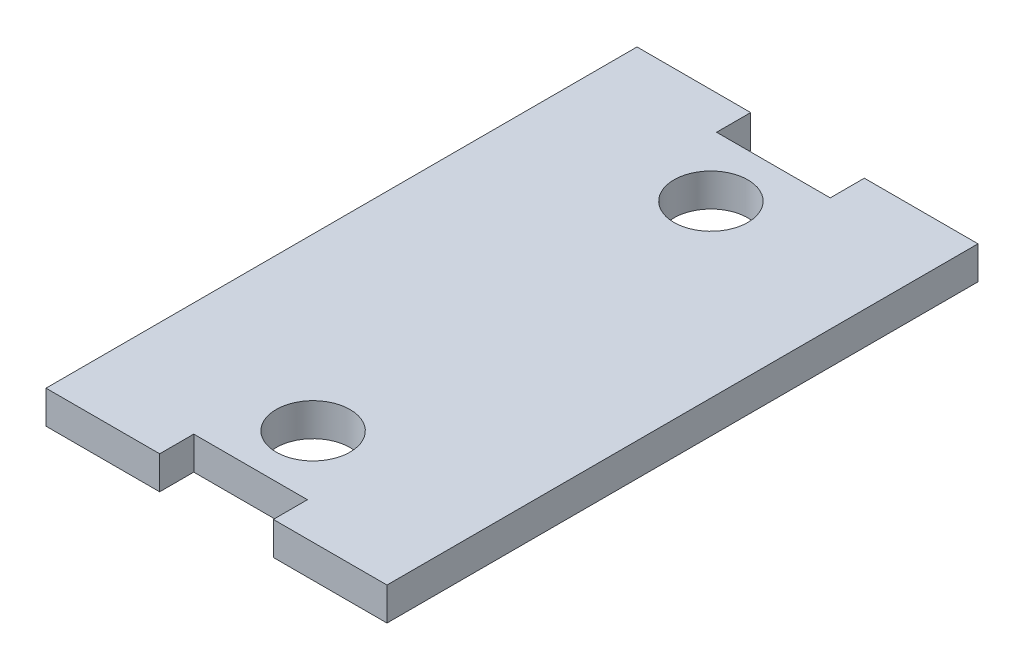
ISO-10303-21;
HEADER;
FILE_DESCRIPTION(('STEP AP214'),'2;1');
FILE_NAME('part.step','',(''),(''),'','','');
FILE_SCHEMA(('AUTOMOTIVE_DESIGN { 1 0 10303 214 1 1 1 1 }'));
ENDSEC;
DATA;
#1=APPLICATION_CONTEXT('core data for automotive mechanical design processes');
#2=APPLICATION_PROTOCOL_DEFINITION('international standard','automotive_design',2000,#1);
#3=PRODUCT_CONTEXT('',#1,'mechanical');
#4=PRODUCT('Part','Part','',(#3));
#5=PRODUCT_RELATED_PRODUCT_CATEGORY('part','',(#4));
#6=PRODUCT_DEFINITION_FORMATION('','',#4);
#7=PRODUCT_DEFINITION_CONTEXT('part definition',#1,'design');
#8=PRODUCT_DEFINITION('design','',#6,#7);
#9=PRODUCT_DEFINITION_SHAPE('','',#8);
#10=(LENGTH_UNIT() NAMED_UNIT(*) SI_UNIT(.MILLI.,.METRE.));
#11=(NAMED_UNIT(*) PLANE_ANGLE_UNIT() SI_UNIT($,.RADIAN.));
#12=(NAMED_UNIT(*) SI_UNIT($,.STERADIAN.) SOLID_ANGLE_UNIT());
#13=UNCERTAINTY_MEASURE_WITH_UNIT(LENGTH_MEASURE(1.E-05),#10,'distance_accuracy_value','');
#14=(GEOMETRIC_REPRESENTATION_CONTEXT(3) GLOBAL_UNCERTAINTY_ASSIGNED_CONTEXT((#13)) GLOBAL_UNIT_ASSIGNED_CONTEXT((#10,
#11,#12)) REPRESENTATION_CONTEXT('',''));
#15=CARTESIAN_POINT('',(0.,0.,0.));
#16=DIRECTION('',(0.,0.,1.));
#17=DIRECTION('',(1.,0.,0.));
#18=AXIS2_PLACEMENT_3D('',#15,#16,#17);
#19=CARTESIAN_POINT('',(0.,1.45,0.));
#20=DIRECTION('',(0.,-1.,0.));
#21=DIRECTION('',(0.,0.,-1.));
#22=AXIS2_PLACEMENT_3D('',#19,#20,#21);
#23=PLANE('',#22);
#24=DIRECTION('',(1.,0.,0.));
#25=VECTOR('',#24,1.);
#26=CARTESIAN_POINT('',(2.5,1.45,13.));
#27=LINE('',#26,#25);
#28=CARTESIAN_POINT('',(2.5,1.45,13.));
#29=VERTEX_POINT('',#28);
#30=CARTESIAN_POINT('',(7.5,1.45,13.));
#31=VERTEX_POINT('',#30);
#32=EDGE_CURVE('E179',#29,#31,#27,.T.);
#33=ORIENTED_EDGE('',*,*,#32,.T.);
#34=DIRECTION('',(0.,0.,-1.));
#35=VECTOR('',#34,1.);
#36=CARTESIAN_POINT('',(7.5,1.45,-13.));
#37=LINE('',#36,#35);
#38=CARTESIAN_POINT('',(7.5,1.45,-13.));
#39=VERTEX_POINT('',#38);
#40=EDGE_CURVE('E107',#31,#39,#37,.T.);
#41=ORIENTED_EDGE('',*,*,#40,.T.);
#42=DIRECTION('',(-1.,0.,0.));
#43=VECTOR('',#42,1.);
#44=CARTESIAN_POINT('',(2.5,1.45,-13.));
#45=LINE('',#44,#43);
#46=CARTESIAN_POINT('',(2.5,1.45,-13.));
#47=VERTEX_POINT('',#46);
#48=EDGE_CURVE('E206',#39,#47,#45,.T.);
#49=ORIENTED_EDGE('',*,*,#48,.T.);
#50=DIRECTION('',(0.,0.,1.));
#51=VECTOR('',#50,1.);
#52=CARTESIAN_POINT('',(2.5,1.45,-11.5));
#53=LINE('',#52,#51);
#54=CARTESIAN_POINT('',(2.5,1.45,-11.5));
#55=VERTEX_POINT('',#54);
#56=EDGE_CURVE('E225',#47,#55,#53,.T.);
#57=ORIENTED_EDGE('',*,*,#56,.T.);
#58=DIRECTION('',(-1.,0.,0.));
#59=VECTOR('',#58,1.);
#60=CARTESIAN_POINT('',(2.5,1.45,-11.5));
#61=LINE('',#60,#59);
#62=CARTESIAN_POINT('',(-2.5,1.45,-11.5));
#63=VERTEX_POINT('',#62);
#64=EDGE_CURVE('E222',#55,#63,#61,.T.);
#65=ORIENTED_EDGE('',*,*,#64,.T.);
#66=DIRECTION('',(0.,0.,-1.));
#67=VECTOR('',#66,1.);
#68=CARTESIAN_POINT('',(-2.5,1.45,-11.5));
#69=LINE('',#68,#67);
#70=CARTESIAN_POINT('',(-2.5,1.45,-13.));
#71=VERTEX_POINT('',#70);
#72=EDGE_CURVE('E224',#63,#71,#69,.T.);
#73=ORIENTED_EDGE('',*,*,#72,.T.);
#74=DIRECTION('',(-1.,0.,0.));
#75=VECTOR('',#74,1.);
#76=CARTESIAN_POINT('',(-7.5,1.45,-13.));
#77=LINE('',#76,#75);
#78=CARTESIAN_POINT('',(-7.5,1.45,-13.));
#79=VERTEX_POINT('',#78);
#80=EDGE_CURVE('E227',#71,#79,#77,.T.);
#81=ORIENTED_EDGE('',*,*,#80,.T.);
#82=DIRECTION('',(0.,0.,1.));
#83=VECTOR('',#82,1.);
#84=CARTESIAN_POINT('',(-7.5,1.45,-13.));
#85=LINE('',#84,#83);
#86=CARTESIAN_POINT('',(-7.5,1.45,13.));
#87=VERTEX_POINT('',#86);
#88=EDGE_CURVE('E233',#79,#87,#85,.T.);
#89=ORIENTED_EDGE('',*,*,#88,.T.);
#90=DIRECTION('',(1.,0.,0.));
#91=VECTOR('',#90,1.);
#92=CARTESIAN_POINT('',(-7.5,1.45,13.));
#93=LINE('',#92,#91);
#94=CARTESIAN_POINT('',(-2.5,1.45,13.));
#95=VERTEX_POINT('',#94);
#96=EDGE_CURVE('E138',#87,#95,#93,.T.);
#97=ORIENTED_EDGE('',*,*,#96,.T.);
#98=DIRECTION('',(0.,0.,-1.));
#99=VECTOR('',#98,1.);
#100=CARTESIAN_POINT('',(-2.5,1.45,11.5));
#101=LINE('',#100,#99);
#102=CARTESIAN_POINT('',(-2.5,1.45,11.5));
#103=VERTEX_POINT('',#102);
#104=EDGE_CURVE('E132',#95,#103,#101,.T.);
#105=ORIENTED_EDGE('',*,*,#104,.T.);
#106=DIRECTION('',(1.,0.,0.));
#107=VECTOR('',#106,1.);
#108=CARTESIAN_POINT('',(2.5,1.45,11.5));
#109=LINE('',#108,#107);
#110=CARTESIAN_POINT('',(2.5,1.45,11.5));
#111=VERTEX_POINT('',#110);
#112=EDGE_CURVE('E136',#103,#111,#109,.T.);
#113=ORIENTED_EDGE('',*,*,#112,.T.);
#114=DIRECTION('',(0.,0.,1.));
#115=VECTOR('',#114,1.);
#116=CARTESIAN_POINT('',(2.5,1.45,11.5));
#117=LINE('',#116,#115);
#118=EDGE_CURVE('E52',#111,#29,#117,.T.);
#119=ORIENTED_EDGE('',*,*,#118,.T.);
#120=EDGE_LOOP('',(#33,#41,#49,#57,#65,#73,#81,#89,#97,#105,#113,#119));
#121=FACE_BOUND('',#120,.T.);
#122=CARTESIAN_POINT('',(0.,1.45,-8.75));
#123=DIRECTION('',(0.,1.,0.));
#124=DIRECTION('',(0.,0.,1.));
#125=AXIS2_PLACEMENT_3D('',#122,#123,#124);
#126=CIRCLE('',#125,1.625);
#127=CARTESIAN_POINT('',(0.,1.45,-7.125));
#128=VERTEX_POINT('',#127);
#129=EDGE_CURVE('E160',#128,#128,#126,.T.);
#130=ORIENTED_EDGE('',*,*,#129,.F.);
#131=EDGE_LOOP('',(#130));
#132=FACE_BOUND('',#131,.T.);
#133=CARTESIAN_POINT('',(0.,1.45,8.75));
#134=DIRECTION('',(0.,1.,0.));
#135=DIRECTION('',(0.,0.,-1.));
#136=AXIS2_PLACEMENT_3D('',#133,#134,#135);
#137=CIRCLE('',#136,1.625);
#138=CARTESIAN_POINT('',(0.,1.45,7.125));
#139=VERTEX_POINT('',#138);
#140=EDGE_CURVE('E274',#139,#139,#137,.T.);
#141=ORIENTED_EDGE('',*,*,#140,.F.);
#142=EDGE_LOOP('',(#141));
#143=FACE_BOUND('',#142,.T.);
#144=ADVANCED_FACE('F35',(#121,#132,#143),#23,.F.);
#145=CARTESIAN_POINT('',(0.,0.,0.));
#146=DIRECTION('',(0.,-1.,0.));
#147=DIRECTION('',(0.,0.,-1.));
#148=AXIS2_PLACEMENT_3D('',#145,#146,#147);
#149=PLANE('',#148);
#150=CARTESIAN_POINT('',(0.,0.,-8.75));
#151=DIRECTION('',(0.,1.,0.));
#152=DIRECTION('',(0.,0.,1.));
#153=AXIS2_PLACEMENT_3D('',#150,#151,#152);
#154=CIRCLE('',#153,1.625);
#155=CARTESIAN_POINT('',(0.,0.,-7.125));
#156=VERTEX_POINT('',#155);
#157=EDGE_CURVE('E279',#156,#156,#154,.T.);
#158=ORIENTED_EDGE('',*,*,#157,.T.);
#159=EDGE_LOOP('',(#158));
#160=FACE_BOUND('',#159,.T.);
#161=DIRECTION('',(1.,0.,0.));
#162=VECTOR('',#161,1.);
#163=CARTESIAN_POINT('',(2.5,0.,13.));
#164=LINE('',#163,#162);
#165=CARTESIAN_POINT('',(2.5,0.,13.));
#166=VERTEX_POINT('',#165);
#167=CARTESIAN_POINT('',(7.5,0.,13.));
#168=VERTEX_POINT('',#167);
#169=EDGE_CURVE('E156',#166,#168,#164,.T.);
#170=ORIENTED_EDGE('',*,*,#169,.F.);
#171=DIRECTION('',(0.,0.,1.));
#172=VECTOR('',#171,1.);
#173=CARTESIAN_POINT('',(2.5,0.,11.5));
#174=LINE('',#173,#172);
#175=CARTESIAN_POINT('',(2.5,0.,11.5));
#176=VERTEX_POINT('',#175);
#177=EDGE_CURVE('E99',#176,#166,#174,.T.);
#178=ORIENTED_EDGE('',*,*,#177,.F.);
#179=DIRECTION('',(1.,0.,0.));
#180=VECTOR('',#179,1.);
#181=CARTESIAN_POINT('',(2.5,0.,11.5));
#182=LINE('',#181,#180);
#183=CARTESIAN_POINT('',(-2.5,0.,11.5));
#184=VERTEX_POINT('',#183);
#185=EDGE_CURVE('E93',#184,#176,#182,.T.);
#186=ORIENTED_EDGE('',*,*,#185,.F.);
#187=DIRECTION('',(0.,0.,-1.));
#188=VECTOR('',#187,1.);
#189=CARTESIAN_POINT('',(-2.5,0.,11.5));
#190=LINE('',#189,#188);
#191=CARTESIAN_POINT('',(-2.5,0.,13.));
#192=VERTEX_POINT('',#191);
#193=EDGE_CURVE('E146',#192,#184,#190,.T.);
#194=ORIENTED_EDGE('',*,*,#193,.F.);
#195=DIRECTION('',(1.,0.,0.));
#196=VECTOR('',#195,1.);
#197=CARTESIAN_POINT('',(-7.5,0.,13.));
#198=LINE('',#197,#196);
#199=CARTESIAN_POINT('',(-7.5,0.,13.));
#200=VERTEX_POINT('',#199);
#201=EDGE_CURVE('E174',#200,#192,#198,.T.);
#202=ORIENTED_EDGE('',*,*,#201,.F.);
#203=DIRECTION('',(0.,0.,1.));
#204=VECTOR('',#203,1.);
#205=CARTESIAN_POINT('',(-7.5,0.,-13.));
#206=LINE('',#205,#204);
#207=CARTESIAN_POINT('',(-7.5,0.,-13.));
#208=VERTEX_POINT('',#207);
#209=EDGE_CURVE('E172',#208,#200,#206,.T.);
#210=ORIENTED_EDGE('',*,*,#209,.F.);
#211=DIRECTION('',(-1.,0.,0.));
#212=VECTOR('',#211,1.);
#213=CARTESIAN_POINT('',(-7.5,0.,-13.));
#214=LINE('',#213,#212);
#215=CARTESIAN_POINT('',(-2.5,0.,-13.));
#216=VERTEX_POINT('',#215);
#217=EDGE_CURVE('E170',#216,#208,#214,.T.);
#218=ORIENTED_EDGE('',*,*,#217,.F.);
#219=DIRECTION('',(0.,0.,-1.));
#220=VECTOR('',#219,1.);
#221=CARTESIAN_POINT('',(-2.5,0.,-11.5));
#222=LINE('',#221,#220);
#223=CARTESIAN_POINT('',(-2.5,0.,-11.5));
#224=VERTEX_POINT('',#223);
#225=EDGE_CURVE('E168',#224,#216,#222,.T.);
#226=ORIENTED_EDGE('',*,*,#225,.F.);
#227=DIRECTION('',(-1.,0.,0.));
#228=VECTOR('',#227,1.);
#229=CARTESIAN_POINT('',(2.5,0.,-11.5));
#230=LINE('',#229,#228);
#231=CARTESIAN_POINT('',(2.5,0.,-11.5));
#232=VERTEX_POINT('',#231);
#233=EDGE_CURVE('E166',#232,#224,#230,.T.);
#234=ORIENTED_EDGE('',*,*,#233,.F.);
#235=DIRECTION('',(0.,0.,1.));
#236=VECTOR('',#235,1.);
#237=CARTESIAN_POINT('',(2.5,0.,-11.5));
#238=LINE('',#237,#236);
#239=CARTESIAN_POINT('',(2.5,0.,-13.));
#240=VERTEX_POINT('',#239);
#241=EDGE_CURVE('E164',#240,#232,#238,.T.);
#242=ORIENTED_EDGE('',*,*,#241,.F.);
#243=DIRECTION('',(-1.,0.,0.));
#244=VECTOR('',#243,1.);
#245=CARTESIAN_POINT('',(2.5,0.,-13.));
#246=LINE('',#245,#244);
#247=CARTESIAN_POINT('',(7.5,0.,-13.));
#248=VERTEX_POINT('',#247);
#249=EDGE_CURVE('E162',#248,#240,#246,.T.);
#250=ORIENTED_EDGE('',*,*,#249,.F.);
#251=DIRECTION('',(0.,0.,-1.));
#252=VECTOR('',#251,1.);
#253=CARTESIAN_POINT('',(7.5,0.,-13.));
#254=LINE('',#253,#252);
#255=EDGE_CURVE('E159',#168,#248,#254,.T.);
#256=ORIENTED_EDGE('',*,*,#255,.F.);
#257=EDGE_LOOP('',(#170,#178,#186,#194,#202,#210,#218,#226,#234,#242,#250,#256));
#258=FACE_BOUND('',#257,.T.);
#259=CARTESIAN_POINT('',(0.,0.,8.75));
#260=DIRECTION('',(0.,1.,0.));
#261=DIRECTION('',(0.,0.,-1.));
#262=AXIS2_PLACEMENT_3D('',#259,#260,#261);
#263=CIRCLE('',#262,1.625);
#264=CARTESIAN_POINT('',(0.,0.,7.125));
#265=VERTEX_POINT('',#264);
#266=EDGE_CURVE('E277',#265,#265,#263,.T.);
#267=ORIENTED_EDGE('',*,*,#266,.T.);
#268=EDGE_LOOP('',(#267));
#269=FACE_BOUND('',#268,.T.);
#270=ADVANCED_FACE('F210',(#160,#258,#269),#149,.T.);
#271=CARTESIAN_POINT('',(2.5,1.45,13.));
#272=DIRECTION('',(0.,0.,-1.));
#273=DIRECTION('',(-1.,0.,0.));
#274=AXIS2_PLACEMENT_3D('',#271,#272,#273);
#275=PLANE('',#274);
#276=ORIENTED_EDGE('',*,*,#169,.T.);
#277=DIRECTION('',(0.,-1.,0.));
#278=VECTOR('',#277,1.);
#279=CARTESIAN_POINT('',(7.5,1.45,13.));
#280=LINE('',#279,#278);
#281=EDGE_CURVE('E11',#31,#168,#280,.T.);
#282=ORIENTED_EDGE('',*,*,#281,.F.);
#283=ORIENTED_EDGE('',*,*,#32,.F.);
#284=DIRECTION('',(0.,-1.,0.));
#285=VECTOR('',#284,1.);
#286=CARTESIAN_POINT('',(2.5,1.45,13.));
#287=LINE('',#286,#285);
#288=EDGE_CURVE('E152',#29,#166,#287,.T.);
#289=ORIENTED_EDGE('',*,*,#288,.T.);
#290=EDGE_LOOP('',(#276,#282,#283,#289));
#291=FACE_BOUND('',#290,.T.);
#292=ADVANCED_FACE('F37',(#291),#275,.F.);
#293=CARTESIAN_POINT('',(7.5,1.45,-13.));
#294=DIRECTION('',(-1.,0.,0.));
#295=DIRECTION('',(0.,0.,1.));
#296=AXIS2_PLACEMENT_3D('',#293,#294,#295);
#297=PLANE('',#296);
#298=ORIENTED_EDGE('',*,*,#255,.T.);
#299=DIRECTION('',(0.,-1.,0.));
#300=VECTOR('',#299,1.);
#301=CARTESIAN_POINT('',(7.5,1.45,-13.));
#302=LINE('',#301,#300);
#303=EDGE_CURVE('E44',#39,#248,#302,.T.);
#304=ORIENTED_EDGE('',*,*,#303,.F.);
#305=ORIENTED_EDGE('',*,*,#40,.F.);
#306=ORIENTED_EDGE('',*,*,#281,.T.);
#307=EDGE_LOOP('',(#298,#304,#305,#306));
#308=FACE_BOUND('',#307,.T.);
#309=ADVANCED_FACE('F374',(#308),#297,.F.);
#310=CARTESIAN_POINT('',(2.5,1.45,-13.));
#311=DIRECTION('',(0.,0.,1.));
#312=DIRECTION('',(1.,0.,0.));
#313=AXIS2_PLACEMENT_3D('',#310,#311,#312);
#314=PLANE('',#313);
#315=ORIENTED_EDGE('',*,*,#249,.T.);
#316=DIRECTION('',(0.,-1.,0.));
#317=VECTOR('',#316,1.);
#318=CARTESIAN_POINT('',(2.5,1.45,-13.));
#319=LINE('',#318,#317);
#320=EDGE_CURVE('E198',#47,#240,#319,.T.);
#321=ORIENTED_EDGE('',*,*,#320,.F.);
#322=ORIENTED_EDGE('',*,*,#48,.F.);
#323=ORIENTED_EDGE('',*,*,#303,.T.);
#324=EDGE_LOOP('',(#315,#321,#322,#323));
#325=FACE_BOUND('',#324,.T.);
#326=ADVANCED_FACE('F204',(#325),#314,.F.);
#327=CARTESIAN_POINT('',(2.5,1.45,-11.5));
#328=DIRECTION('',(1.,0.,0.));
#329=DIRECTION('',(0.,0.,-1.));
#330=AXIS2_PLACEMENT_3D('',#327,#328,#329);
#331=PLANE('',#330);
#332=ORIENTED_EDGE('',*,*,#241,.T.);
#333=DIRECTION('',(0.,-1.,0.));
#334=VECTOR('',#333,1.);
#335=CARTESIAN_POINT('',(2.5,1.45,-11.5));
#336=LINE('',#335,#334);
#337=EDGE_CURVE('E195',#55,#232,#336,.T.);
#338=ORIENTED_EDGE('',*,*,#337,.F.);
#339=ORIENTED_EDGE('',*,*,#56,.F.);
#340=ORIENTED_EDGE('',*,*,#320,.T.);
#341=EDGE_LOOP('',(#332,#338,#339,#340));
#342=FACE_BOUND('',#341,.T.);
#343=ADVANCED_FACE('F216',(#342),#331,.F.);
#344=CARTESIAN_POINT('',(2.5,1.45,-11.5));
#345=DIRECTION('',(0.,0.,1.));
#346=DIRECTION('',(1.,0.,0.));
#347=AXIS2_PLACEMENT_3D('',#344,#345,#346);
#348=PLANE('',#347);
#349=ORIENTED_EDGE('',*,*,#233,.T.);
#350=DIRECTION('',(0.,-1.,0.));
#351=VECTOR('',#350,1.);
#352=CARTESIAN_POINT('',(-2.5,1.45,-11.5));
#353=LINE('',#352,#351);
#354=EDGE_CURVE('E192',#63,#224,#353,.T.);
#355=ORIENTED_EDGE('',*,*,#354,.F.);
#356=ORIENTED_EDGE('',*,*,#64,.F.);
#357=ORIENTED_EDGE('',*,*,#337,.T.);
#358=EDGE_LOOP('',(#349,#355,#356,#357));
#359=FACE_BOUND('',#358,.T.);
#360=ADVANCED_FACE('F220',(#359),#348,.F.);
#361=CARTESIAN_POINT('',(-2.5,1.45,-11.5));
#362=DIRECTION('',(-1.,0.,0.));
#363=DIRECTION('',(0.,0.,1.));
#364=AXIS2_PLACEMENT_3D('',#361,#362,#363);
#365=PLANE('',#364);
#366=ORIENTED_EDGE('',*,*,#225,.T.);
#367=DIRECTION('',(0.,-1.,0.));
#368=VECTOR('',#367,1.);
#369=CARTESIAN_POINT('',(-2.5,1.45,-13.));
#370=LINE('',#369,#368);
#371=EDGE_CURVE('E189',#71,#216,#370,.T.);
#372=ORIENTED_EDGE('',*,*,#371,.F.);
#373=ORIENTED_EDGE('',*,*,#72,.F.);
#374=ORIENTED_EDGE('',*,*,#354,.T.);
#375=EDGE_LOOP('',(#366,#372,#373,#374));
#376=FACE_BOUND('',#375,.T.);
#377=ADVANCED_FACE('F339',(#376),#365,.F.);
#378=CARTESIAN_POINT('',(-7.5,1.45,-13.));
#379=DIRECTION('',(0.,0.,1.));
#380=DIRECTION('',(1.,0.,0.));
#381=AXIS2_PLACEMENT_3D('',#378,#379,#380);
#382=PLANE('',#381);
#383=ORIENTED_EDGE('',*,*,#217,.T.);
#384=DIRECTION('',(0.,-1.,0.));
#385=VECTOR('',#384,1.);
#386=CARTESIAN_POINT('',(-7.5,1.45,-13.));
#387=LINE('',#386,#385);
#388=EDGE_CURVE('E186',#79,#208,#387,.T.);
#389=ORIENTED_EDGE('',*,*,#388,.F.);
#390=ORIENTED_EDGE('',*,*,#80,.F.);
#391=ORIENTED_EDGE('',*,*,#371,.T.);
#392=EDGE_LOOP('',(#383,#389,#390,#391));
#393=FACE_BOUND('',#392,.T.);
#394=ADVANCED_FACE('F330',(#393),#382,.F.);
#395=CARTESIAN_POINT('',(-7.5,1.45,-13.));
#396=DIRECTION('',(1.,0.,0.));
#397=DIRECTION('',(0.,0.,-1.));
#398=AXIS2_PLACEMENT_3D('',#395,#396,#397);
#399=PLANE('',#398);
#400=ORIENTED_EDGE('',*,*,#209,.T.);
#401=DIRECTION('',(0.,-1.,0.));
#402=VECTOR('',#401,1.);
#403=CARTESIAN_POINT('',(-7.5,1.45,13.));
#404=LINE('',#403,#402);
#405=EDGE_CURVE('E183',#87,#200,#404,.T.);
#406=ORIENTED_EDGE('',*,*,#405,.F.);
#407=ORIENTED_EDGE('',*,*,#88,.F.);
#408=ORIENTED_EDGE('',*,*,#388,.T.);
#409=EDGE_LOOP('',(#400,#406,#407,#408));
#410=FACE_BOUND('',#409,.T.);
#411=ADVANCED_FACE('F239',(#410),#399,.F.);
#412=CARTESIAN_POINT('',(-7.5,1.45,13.));
#413=DIRECTION('',(0.,0.,-1.));
#414=DIRECTION('',(-1.,0.,0.));
#415=AXIS2_PLACEMENT_3D('',#412,#413,#414);
#416=PLANE('',#415);
#417=ORIENTED_EDGE('',*,*,#201,.T.);
#418=DIRECTION('',(0.,-1.,0.));
#419=VECTOR('',#418,1.);
#420=CARTESIAN_POINT('',(-2.5,1.45,13.));
#421=LINE('',#420,#419);
#422=EDGE_CURVE('E147',#95,#192,#421,.T.);
#423=ORIENTED_EDGE('',*,*,#422,.F.);
#424=ORIENTED_EDGE('',*,*,#96,.F.);
#425=ORIENTED_EDGE('',*,*,#405,.T.);
#426=EDGE_LOOP('',(#417,#423,#424,#425));
#427=FACE_BOUND('',#426,.T.);
#428=ADVANCED_FACE('F243',(#427),#416,.F.);
#429=CARTESIAN_POINT('',(-2.5,1.45,11.5));
#430=DIRECTION('',(-1.,0.,0.));
#431=DIRECTION('',(0.,0.,1.));
#432=AXIS2_PLACEMENT_3D('',#429,#430,#431);
#433=PLANE('',#432);
#434=ORIENTED_EDGE('',*,*,#193,.T.);
#435=DIRECTION('',(0.,-1.,0.));
#436=VECTOR('',#435,1.);
#437=CARTESIAN_POINT('',(-2.5,1.45,11.5));
#438=LINE('',#437,#436);
#439=EDGE_CURVE('E143',#103,#184,#438,.T.);
#440=ORIENTED_EDGE('',*,*,#439,.F.);
#441=ORIENTED_EDGE('',*,*,#104,.F.);
#442=ORIENTED_EDGE('',*,*,#422,.T.);
#443=EDGE_LOOP('',(#434,#440,#441,#442));
#444=FACE_BOUND('',#443,.T.);
#445=ADVANCED_FACE('F144',(#444),#433,.F.);
#446=CARTESIAN_POINT('',(2.5,1.45,11.5));
#447=DIRECTION('',(0.,0.,-1.));
#448=DIRECTION('',(-1.,0.,0.));
#449=AXIS2_PLACEMENT_3D('',#446,#447,#448);
#450=PLANE('',#449);
#451=ORIENTED_EDGE('',*,*,#185,.T.);
#452=DIRECTION('',(0.,-1.,0.));
#453=VECTOR('',#452,1.);
#454=CARTESIAN_POINT('',(2.5,1.45,11.5));
#455=LINE('',#454,#453);
#456=EDGE_CURVE('E148',#111,#176,#455,.T.);
#457=ORIENTED_EDGE('',*,*,#456,.F.);
#458=ORIENTED_EDGE('',*,*,#112,.F.);
#459=ORIENTED_EDGE('',*,*,#439,.T.);
#460=EDGE_LOOP('',(#451,#457,#458,#459));
#461=FACE_BOUND('',#460,.T.);
#462=ADVANCED_FACE('F150',(#461),#450,.F.);
#463=CARTESIAN_POINT('',(2.5,1.45,11.5));
#464=DIRECTION('',(1.,0.,0.));
#465=DIRECTION('',(0.,0.,-1.));
#466=AXIS2_PLACEMENT_3D('',#463,#464,#465);
#467=PLANE('',#466);
#468=ORIENTED_EDGE('',*,*,#177,.T.);
#469=ORIENTED_EDGE('',*,*,#288,.F.);
#470=ORIENTED_EDGE('',*,*,#118,.F.);
#471=ORIENTED_EDGE('',*,*,#456,.T.);
#472=EDGE_LOOP('',(#468,#469,#470,#471));
#473=FACE_BOUND('',#472,.T.);
#474=ADVANCED_FACE('F247',(#473),#467,.F.);
#475=CARTESIAN_POINT('',(0.,1.45,-8.75));
#476=DIRECTION('',(0.,-1.,0.));
#477=DIRECTION('',(0.,0.,-1.));
#478=AXIS2_PLACEMENT_3D('',#475,#476,#477);
#479=CYLINDRICAL_SURFACE('',#478,1.625);
#480=ORIENTED_EDGE('',*,*,#129,.T.);
#481=EDGE_LOOP('',(#480));
#482=FACE_BOUND('',#481,.T.);
#483=ORIENTED_EDGE('',*,*,#157,.F.);
#484=EDGE_LOOP('',(#483));
#485=FACE_BOUND('',#484,.T.);
#486=ADVANCED_FACE('F249',(#482,#485),#479,.F.);
#487=CARTESIAN_POINT('',(0.,1.45,8.75));
#488=DIRECTION('',(0.,-1.,0.));
#489=DIRECTION('',(0.,0.,-1.));
#490=AXIS2_PLACEMENT_3D('',#487,#488,#489);
#491=CYLINDRICAL_SURFACE('',#490,1.625);
#492=ORIENTED_EDGE('',*,*,#140,.T.);
#493=EDGE_LOOP('',(#492));
#494=FACE_BOUND('',#493,.T.);
#495=ORIENTED_EDGE('',*,*,#266,.F.);
#496=EDGE_LOOP('',(#495));
#497=FACE_BOUND('',#496,.T.);
#498=ADVANCED_FACE('F255',(#494,#497),#491,.F.);
#499=CLOSED_SHELL('',(#144,#270,#292,#309,#326,#343,#360,#377,#394,#411,#428,#445,#462,#474,
#486,#498));
#500=MANIFOLD_SOLID_BREP('B2',#499);
#501=ADVANCED_BREP_SHAPE_REPRESENTATION('',(#18,#500),#14);
#502=SHAPE_DEFINITION_REPRESENTATION(#9,#501);
ENDSEC;
END-ISO-10303-21;
